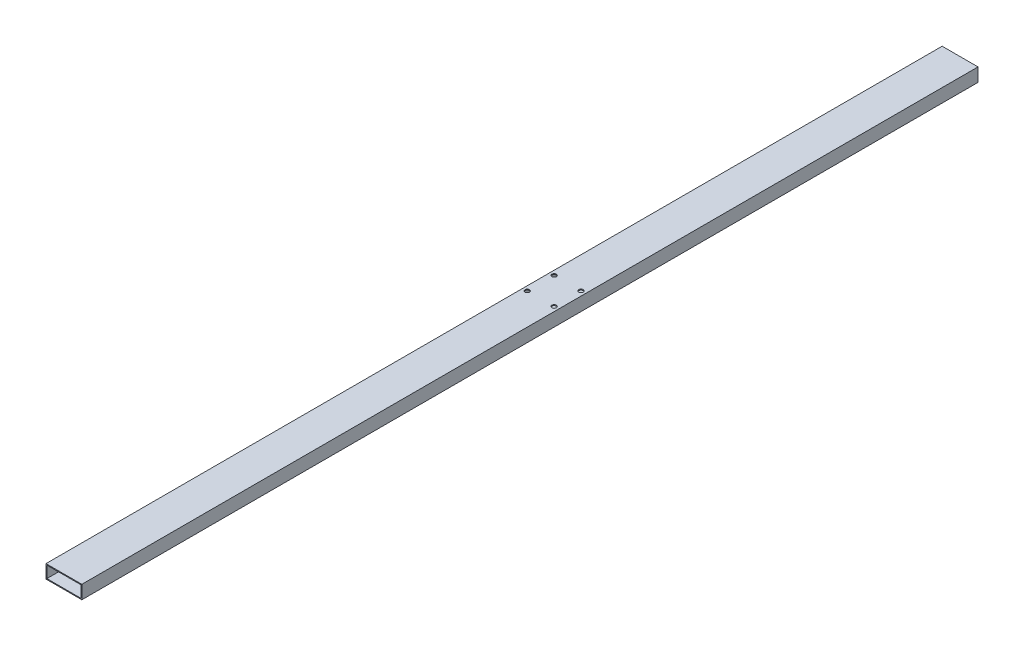
ISO-10303-21;
HEADER;
FILE_DESCRIPTION(('STEP AP214'),'2;1');
FILE_NAME('part.step','',(''),(''),'','','');
FILE_SCHEMA(('AUTOMOTIVE_DESIGN { 1 0 10303 214 1 1 1 1 }'));
ENDSEC;
DATA;
#1=APPLICATION_CONTEXT('core data for automotive mechanical design processes');
#2=APPLICATION_PROTOCOL_DEFINITION('international standard','automotive_design',2000,#1);
#3=PRODUCT_CONTEXT('',#1,'mechanical');
#4=PRODUCT('Part','Part','',(#3));
#5=PRODUCT_RELATED_PRODUCT_CATEGORY('part','',(#4));
#6=PRODUCT_DEFINITION_FORMATION('','',#4);
#7=PRODUCT_DEFINITION_CONTEXT('part definition',#1,'design');
#8=PRODUCT_DEFINITION('design','',#6,#7);
#9=PRODUCT_DEFINITION_SHAPE('','',#8);
#10=(LENGTH_UNIT() NAMED_UNIT(*) SI_UNIT(.MILLI.,.METRE.));
#11=(NAMED_UNIT(*) PLANE_ANGLE_UNIT() SI_UNIT($,.RADIAN.));
#12=(NAMED_UNIT(*) SI_UNIT($,.STERADIAN.) SOLID_ANGLE_UNIT());
#13=UNCERTAINTY_MEASURE_WITH_UNIT(LENGTH_MEASURE(1.E-05),#10,'distance_accuracy_value','');
#14=(GEOMETRIC_REPRESENTATION_CONTEXT(3) GLOBAL_UNCERTAINTY_ASSIGNED_CONTEXT((#13)) GLOBAL_UNIT_ASSIGNED_CONTEXT((#10,
#11,#12)) REPRESENTATION_CONTEXT('',''));
#15=CARTESIAN_POINT('',(0.,0.,0.));
#16=DIRECTION('',(0.,0.,1.));
#17=DIRECTION('',(1.,0.,0.));
#18=AXIS2_PLACEMENT_3D('',#15,#16,#17);
#19=CARTESIAN_POINT('',(0.,0.,1000.));
#20=DIRECTION('',(0.,0.,-1.));
#21=DIRECTION('',(-1.,0.,0.));
#22=AXIS2_PLACEMENT_3D('',#19,#20,#21);
#23=PLANE('',#22);
#24=DIRECTION('',(0.,-1.,0.));
#25=VECTOR('',#24,1.);
#26=CARTESIAN_POINT('',(0.,0.,1000.));
#27=LINE('',#26,#25);
#28=CARTESIAN_POINT('',(0.,15.,1000.));
#29=VERTEX_POINT('',#28);
#30=CARTESIAN_POINT('',(0.,0.,1000.));
#31=VERTEX_POINT('',#30);
#32=EDGE_CURVE('E140',#29,#31,#27,.T.);
#33=ORIENTED_EDGE('',*,*,#32,.T.);
#34=DIRECTION('',(1.,0.,0.));
#35=VECTOR('',#34,1.);
#36=CARTESIAN_POINT('',(0.,0.,1000.));
#37=LINE('',#36,#35);
#38=CARTESIAN_POINT('',(40.,0.,1000.));
#39=VERTEX_POINT('',#38);
#40=EDGE_CURVE('E143',#31,#39,#37,.T.);
#41=ORIENTED_EDGE('',*,*,#40,.T.);
#42=DIRECTION('',(0.,1.,0.));
#43=VECTOR('',#42,1.);
#44=CARTESIAN_POINT('',(40.,0.,1000.));
#45=LINE('',#44,#43);
#46=CARTESIAN_POINT('',(40.,15.,1000.));
#47=VERTEX_POINT('',#46);
#48=EDGE_CURVE('E146',#39,#47,#45,.T.);
#49=ORIENTED_EDGE('',*,*,#48,.T.);
#50=DIRECTION('',(-1.,0.,0.));
#51=VECTOR('',#50,1.);
#52=CARTESIAN_POINT('',(0.,15.,1000.));
#53=LINE('',#52,#51);
#54=EDGE_CURVE('E148',#47,#29,#53,.T.);
#55=ORIENTED_EDGE('',*,*,#54,.T.);
#56=EDGE_LOOP('',(#33,#41,#49,#55));
#57=FACE_BOUND('',#56,.T.);
#58=DIRECTION('',(0.,-1.,0.));
#59=VECTOR('',#58,1.);
#60=CARTESIAN_POINT('',(1.,1.,1000.));
#61=LINE('',#60,#59);
#62=CARTESIAN_POINT('',(1.,14.,1000.));
#63=VERTEX_POINT('',#62);
#64=CARTESIAN_POINT('',(1.,1.,1000.));
#65=VERTEX_POINT('',#64);
#66=EDGE_CURVE('E102',#63,#65,#61,.T.);
#67=ORIENTED_EDGE('',*,*,#66,.F.);
#68=DIRECTION('',(-1.,0.,0.));
#69=VECTOR('',#68,1.);
#70=CARTESIAN_POINT('',(1.,14.,1000.));
#71=LINE('',#70,#69);
#72=CARTESIAN_POINT('',(39.,14.,1000.));
#73=VERTEX_POINT('',#72);
#74=EDGE_CURVE('E124',#73,#63,#71,.T.);
#75=ORIENTED_EDGE('',*,*,#74,.F.);
#76=DIRECTION('',(0.,1.,0.));
#77=VECTOR('',#76,1.);
#78=CARTESIAN_POINT('',(39.,1.,1000.));
#79=LINE('',#78,#77);
#80=CARTESIAN_POINT('',(39.,1.,1000.));
#81=VERTEX_POINT('',#80);
#82=EDGE_CURVE('E122',#81,#73,#79,.T.);
#83=ORIENTED_EDGE('',*,*,#82,.F.);
#84=DIRECTION('',(1.,0.,0.));
#85=VECTOR('',#84,1.);
#86=CARTESIAN_POINT('',(1.,1.,1000.));
#87=LINE('',#86,#85);
#88=EDGE_CURVE('E110',#65,#81,#87,.T.);
#89=ORIENTED_EDGE('',*,*,#88,.F.);
#90=EDGE_LOOP('',(#67,#75,#83,#89));
#91=FACE_BOUND('',#90,.T.);
#92=ADVANCED_FACE('F35',(#57,#91),#23,.F.);
#93=CARTESIAN_POINT('',(0.,0.,0.));
#94=DIRECTION('',(0.,0.,-1.));
#95=DIRECTION('',(-1.,0.,0.));
#96=AXIS2_PLACEMENT_3D('',#93,#94,#95);
#97=PLANE('',#96);
#98=DIRECTION('',(0.,-1.,0.));
#99=VECTOR('',#98,1.);
#100=CARTESIAN_POINT('',(0.,0.,0.));
#101=LINE('',#100,#99);
#102=CARTESIAN_POINT('',(0.,15.,0.));
#103=VERTEX_POINT('',#102);
#104=CARTESIAN_POINT('',(0.,0.,0.));
#105=VERTEX_POINT('',#104);
#106=EDGE_CURVE('E118',#103,#105,#101,.T.);
#107=ORIENTED_EDGE('',*,*,#106,.F.);
#108=DIRECTION('',(-1.,0.,0.));
#109=VECTOR('',#108,1.);
#110=CARTESIAN_POINT('',(0.,15.,0.));
#111=LINE('',#110,#109);
#112=CARTESIAN_POINT('',(40.,15.,0.));
#113=VERTEX_POINT('',#112);
#114=EDGE_CURVE('E144',#113,#103,#111,.T.);
#115=ORIENTED_EDGE('',*,*,#114,.F.);
#116=DIRECTION('',(0.,1.,0.));
#117=VECTOR('',#116,1.);
#118=CARTESIAN_POINT('',(40.,0.,0.));
#119=LINE('',#118,#117);
#120=CARTESIAN_POINT('',(40.,0.,0.));
#121=VERTEX_POINT('',#120);
#122=EDGE_CURVE('E155',#121,#113,#119,.T.);
#123=ORIENTED_EDGE('',*,*,#122,.F.);
#124=DIRECTION('',(1.,0.,0.));
#125=VECTOR('',#124,1.);
#126=CARTESIAN_POINT('',(0.,0.,0.));
#127=LINE('',#126,#125);
#128=EDGE_CURVE('E153',#105,#121,#127,.T.);
#129=ORIENTED_EDGE('',*,*,#128,.F.);
#130=EDGE_LOOP('',(#107,#115,#123,#129));
#131=FACE_BOUND('',#130,.T.);
#132=DIRECTION('',(-1.,0.,0.));
#133=VECTOR('',#132,1.);
#134=CARTESIAN_POINT('',(1.,14.,0.));
#135=LINE('',#134,#133);
#136=CARTESIAN_POINT('',(39.,14.,0.));
#137=VERTEX_POINT('',#136);
#138=CARTESIAN_POINT('',(1.,14.,0.));
#139=VERTEX_POINT('',#138);
#140=EDGE_CURVE('E111',#137,#139,#135,.T.);
#141=ORIENTED_EDGE('',*,*,#140,.T.);
#142=DIRECTION('',(0.,-1.,0.));
#143=VECTOR('',#142,1.);
#144=CARTESIAN_POINT('',(1.,1.,0.));
#145=LINE('',#144,#143);
#146=CARTESIAN_POINT('',(1.,1.,0.));
#147=VERTEX_POINT('',#146);
#148=EDGE_CURVE('E60',#139,#147,#145,.T.);
#149=ORIENTED_EDGE('',*,*,#148,.T.);
#150=DIRECTION('',(1.,0.,0.));
#151=VECTOR('',#150,1.);
#152=CARTESIAN_POINT('',(1.,1.,0.));
#153=LINE('',#152,#151);
#154=CARTESIAN_POINT('',(39.,1.,0.));
#155=VERTEX_POINT('',#154);
#156=EDGE_CURVE('E117',#147,#155,#153,.T.);
#157=ORIENTED_EDGE('',*,*,#156,.T.);
#158=DIRECTION('',(0.,1.,0.));
#159=VECTOR('',#158,1.);
#160=CARTESIAN_POINT('',(39.,1.,0.));
#161=LINE('',#160,#159);
#162=EDGE_CURVE('E132',#155,#137,#161,.T.);
#163=ORIENTED_EDGE('',*,*,#162,.T.);
#164=EDGE_LOOP('',(#141,#149,#157,#163));
#165=FACE_BOUND('',#164,.T.);
#166=ADVANCED_FACE('F207',(#131,#165),#97,.T.);
#167=CARTESIAN_POINT('',(0.,0.,1000.));
#168=DIRECTION('',(1.,0.,0.));
#169=DIRECTION('',(0.,0.,-1.));
#170=AXIS2_PLACEMENT_3D('',#167,#168,#169);
#171=PLANE('',#170);
#172=ORIENTED_EDGE('',*,*,#106,.T.);
#173=DIRECTION('',(0.,0.,-1.));
#174=VECTOR('',#173,1.);
#175=CARTESIAN_POINT('',(0.,0.,1000.));
#176=LINE('',#175,#174);
#177=EDGE_CURVE('E11',#31,#105,#176,.T.);
#178=ORIENTED_EDGE('',*,*,#177,.F.);
#179=ORIENTED_EDGE('',*,*,#32,.F.);
#180=DIRECTION('',(0.,0.,-1.));
#181=VECTOR('',#180,1.);
#182=CARTESIAN_POINT('',(0.,15.,1000.));
#183=LINE('',#182,#181);
#184=EDGE_CURVE('E150',#29,#103,#183,.T.);
#185=ORIENTED_EDGE('',*,*,#184,.T.);
#186=EDGE_LOOP('',(#172,#178,#179,#185));
#187=FACE_BOUND('',#186,.T.);
#188=ADVANCED_FACE('F37',(#187),#171,.F.);
#189=CARTESIAN_POINT('',(0.,0.,1000.));
#190=DIRECTION('',(0.,1.,0.));
#191=DIRECTION('',(0.,0.,1.));
#192=AXIS2_PLACEMENT_3D('',#189,#190,#191);
#193=PLANE('',#192);
#194=CARTESIAN_POINT('',(35.0000000000011,0.,438.000000000003));
#195=DIRECTION('',(0.,-1.,0.));
#196=DIRECTION('',(0.,0.,-1.));
#197=AXIS2_PLACEMENT_3D('',#194,#195,#196);
#198=CIRCLE('',#197,2.49999999999817);
#199=CARTESIAN_POINT('',(35.0000000000011,0.,435.500000000005));
#200=VERTEX_POINT('',#199);
#201=EDGE_CURVE('E243',#200,#200,#198,.T.);
#202=ORIENTED_EDGE('',*,*,#201,.F.);
#203=EDGE_LOOP('',(#202));
#204=FACE_BOUND('',#203,.T.);
#205=CARTESIAN_POINT('',(5.00000000000111,0.,468.000000000003));
#206=DIRECTION('',(0.,-1.,0.));
#207=DIRECTION('',(0.,0.,-1.));
#208=AXIS2_PLACEMENT_3D('',#205,#206,#207);
#209=CIRCLE('',#208,2.49999999999817);
#210=CARTESIAN_POINT('',(5.00000000000111,0.,465.500000000005));
#211=VERTEX_POINT('',#210);
#212=EDGE_CURVE('E247',#211,#211,#209,.T.);
#213=ORIENTED_EDGE('',*,*,#212,.F.);
#214=EDGE_LOOP('',(#213));
#215=FACE_BOUND('',#214,.T.);
#216=CARTESIAN_POINT('',(5.0000000000011,0.,438.000000000003));
#217=DIRECTION('',(0.,-1.,0.));
#218=DIRECTION('',(0.,0.,-1.));
#219=AXIS2_PLACEMENT_3D('',#216,#217,#218);
#220=CIRCLE('',#219,2.49999999999817);
#221=CARTESIAN_POINT('',(5.0000000000011,0.,435.500000000005));
#222=VERTEX_POINT('',#221);
#223=EDGE_CURVE('E251',#222,#222,#220,.T.);
#224=ORIENTED_EDGE('',*,*,#223,.F.);
#225=EDGE_LOOP('',(#224));
#226=FACE_BOUND('',#225,.T.);
#227=CARTESIAN_POINT('',(35.0000000000011,0.,468.000000000003));
#228=DIRECTION('',(0.,-1.,0.));
#229=DIRECTION('',(0.,0.,-1.));
#230=AXIS2_PLACEMENT_3D('',#227,#228,#229);
#231=CIRCLE('',#230,2.49999999999812);
#232=CARTESIAN_POINT('',(35.0000000000011,0.,465.500000000005));
#233=VERTEX_POINT('',#232);
#234=EDGE_CURVE('E255',#233,#233,#231,.T.);
#235=ORIENTED_EDGE('',*,*,#234,.F.);
#236=EDGE_LOOP('',(#235));
#237=FACE_BOUND('',#236,.T.);
#238=ORIENTED_EDGE('',*,*,#128,.T.);
#239=DIRECTION('',(0.,0.,-1.));
#240=VECTOR('',#239,1.);
#241=CARTESIAN_POINT('',(40.,0.,1000.));
#242=LINE('',#241,#240);
#243=EDGE_CURVE('E44',#39,#121,#242,.T.);
#244=ORIENTED_EDGE('',*,*,#243,.F.);
#245=ORIENTED_EDGE('',*,*,#40,.F.);
#246=ORIENTED_EDGE('',*,*,#177,.T.);
#247=EDGE_LOOP('',(#238,#244,#245,#246));
#248=FACE_BOUND('',#247,.T.);
#249=ADVANCED_FACE('F232',(#204,#215,#226,#237,#248),#193,.F.);
#250=CARTESIAN_POINT('',(40.,0.,1000.));
#251=DIRECTION('',(-1.,0.,0.));
#252=DIRECTION('',(0.,0.,1.));
#253=AXIS2_PLACEMENT_3D('',#250,#251,#252);
#254=PLANE('',#253);
#255=ORIENTED_EDGE('',*,*,#122,.T.);
#256=DIRECTION('',(0.,0.,-1.));
#257=VECTOR('',#256,1.);
#258=CARTESIAN_POINT('',(40.,15.,1000.));
#259=LINE('',#258,#257);
#260=EDGE_CURVE('E160',#47,#113,#259,.T.);
#261=ORIENTED_EDGE('',*,*,#260,.F.);
#262=ORIENTED_EDGE('',*,*,#48,.F.);
#263=ORIENTED_EDGE('',*,*,#243,.T.);
#264=EDGE_LOOP('',(#255,#261,#262,#263));
#265=FACE_BOUND('',#264,.T.);
#266=ADVANCED_FACE('F229',(#265),#254,.F.);
#267=CARTESIAN_POINT('',(0.,15.,1000.));
#268=DIRECTION('',(0.,-1.,0.));
#269=DIRECTION('',(0.,0.,-1.));
#270=AXIS2_PLACEMENT_3D('',#267,#268,#269);
#271=PLANE('',#270);
#272=CARTESIAN_POINT('',(35.0000000000011,15.,438.000000000003));
#273=DIRECTION('',(0.,-1.,0.));
#274=DIRECTION('',(0.,0.,-1.));
#275=AXIS2_PLACEMENT_3D('',#272,#273,#274);
#276=CIRCLE('',#275,2.49999999999817);
#277=CARTESIAN_POINT('',(35.0000000000011,15.,435.500000000005));
#278=VERTEX_POINT('',#277);
#279=EDGE_CURVE('E268',#278,#278,#276,.T.);
#280=ORIENTED_EDGE('',*,*,#279,.T.);
#281=EDGE_LOOP('',(#280));
#282=FACE_BOUND('',#281,.T.);
#283=CARTESIAN_POINT('',(5.00000000000111,15.,468.000000000003));
#284=DIRECTION('',(0.,-1.,0.));
#285=DIRECTION('',(0.,0.,-1.));
#286=AXIS2_PLACEMENT_3D('',#283,#284,#285);
#287=CIRCLE('',#286,2.49999999999817);
#288=CARTESIAN_POINT('',(5.00000000000111,15.,465.500000000005));
#289=VERTEX_POINT('',#288);
#290=EDGE_CURVE('E275',#289,#289,#287,.T.);
#291=ORIENTED_EDGE('',*,*,#290,.T.);
#292=EDGE_LOOP('',(#291));
#293=FACE_BOUND('',#292,.T.);
#294=CARTESIAN_POINT('',(5.0000000000011,15.,438.000000000003));
#295=DIRECTION('',(0.,-1.,0.));
#296=DIRECTION('',(0.,0.,-1.));
#297=AXIS2_PLACEMENT_3D('',#294,#295,#296);
#298=CIRCLE('',#297,2.49999999999817);
#299=CARTESIAN_POINT('',(5.0000000000011,15.,435.500000000005));
#300=VERTEX_POINT('',#299);
#301=EDGE_CURVE('E276',#300,#300,#298,.T.);
#302=ORIENTED_EDGE('',*,*,#301,.T.);
#303=EDGE_LOOP('',(#302));
#304=FACE_BOUND('',#303,.T.);
#305=CARTESIAN_POINT('',(35.0000000000011,15.,468.000000000003));
#306=DIRECTION('',(0.,-1.,0.));
#307=DIRECTION('',(0.,0.,-1.));
#308=AXIS2_PLACEMENT_3D('',#305,#306,#307);
#309=CIRCLE('',#308,2.49999999999812);
#310=CARTESIAN_POINT('',(35.0000000000011,15.,465.500000000005));
#311=VERTEX_POINT('',#310);
#312=EDGE_CURVE('E169',#311,#311,#309,.T.);
#313=ORIENTED_EDGE('',*,*,#312,.T.);
#314=EDGE_LOOP('',(#313));
#315=FACE_BOUND('',#314,.T.);
#316=ORIENTED_EDGE('',*,*,#114,.T.);
#317=ORIENTED_EDGE('',*,*,#184,.F.);
#318=ORIENTED_EDGE('',*,*,#54,.F.);
#319=ORIENTED_EDGE('',*,*,#260,.T.);
#320=EDGE_LOOP('',(#316,#317,#318,#319));
#321=FACE_BOUND('',#320,.T.);
#322=ADVANCED_FACE('F226',(#282,#293,#304,#315,#321),#271,.F.);
#323=CARTESIAN_POINT('',(1.,1.,1000.));
#324=DIRECTION('',(1.,0.,0.));
#325=DIRECTION('',(0.,0.,-1.));
#326=AXIS2_PLACEMENT_3D('',#323,#324,#325);
#327=PLANE('',#326);
#328=ORIENTED_EDGE('',*,*,#148,.F.);
#329=DIRECTION('',(0.,0.,-1.));
#330=VECTOR('',#329,1.);
#331=CARTESIAN_POINT('',(1.,14.,1000.));
#332=LINE('',#331,#330);
#333=EDGE_CURVE('E106',#63,#139,#332,.T.);
#334=ORIENTED_EDGE('',*,*,#333,.F.);
#335=ORIENTED_EDGE('',*,*,#66,.T.);
#336=DIRECTION('',(0.,0.,-1.));
#337=VECTOR('',#336,1.);
#338=CARTESIAN_POINT('',(1.,1.,1000.));
#339=LINE('',#338,#337);
#340=EDGE_CURVE('E105',#65,#147,#339,.T.);
#341=ORIENTED_EDGE('',*,*,#340,.T.);
#342=EDGE_LOOP('',(#328,#334,#335,#341));
#343=FACE_BOUND('',#342,.T.);
#344=ADVANCED_FACE('F104',(#343),#327,.T.);
#345=CARTESIAN_POINT('',(1.,1.,1000.));
#346=DIRECTION('',(0.,1.,0.));
#347=DIRECTION('',(0.,0.,1.));
#348=AXIS2_PLACEMENT_3D('',#345,#346,#347);
#349=PLANE('',#348);
#350=CARTESIAN_POINT('',(35.0000000000011,1.,438.000000000003));
#351=DIRECTION('',(0.,1.,0.));
#352=DIRECTION('',(0.,0.,1.));
#353=AXIS2_PLACEMENT_3D('',#350,#351,#352);
#354=CIRCLE('',#353,2.49999999999817);
#355=CARTESIAN_POINT('',(35.0000000000011,1.,440.500000000001));
#356=VERTEX_POINT('',#355);
#357=EDGE_CURVE('E130',#356,#356,#354,.T.);
#358=ORIENTED_EDGE('',*,*,#357,.F.);
#359=EDGE_LOOP('',(#358));
#360=FACE_BOUND('',#359,.T.);
#361=CARTESIAN_POINT('',(5.00000000000111,1.,468.000000000003));
#362=DIRECTION('',(0.,1.,0.));
#363=DIRECTION('',(0.,0.,1.));
#364=AXIS2_PLACEMENT_3D('',#361,#362,#363);
#365=CIRCLE('',#364,2.49999999999817);
#366=CARTESIAN_POINT('',(5.00000000000111,1.,470.500000000001));
#367=VERTEX_POINT('',#366);
#368=EDGE_CURVE('E175',#367,#367,#365,.T.);
#369=ORIENTED_EDGE('',*,*,#368,.F.);
#370=EDGE_LOOP('',(#369));
#371=FACE_BOUND('',#370,.T.);
#372=CARTESIAN_POINT('',(5.0000000000011,1.,438.000000000003));
#373=DIRECTION('',(0.,1.,0.));
#374=DIRECTION('',(0.,0.,1.));
#375=AXIS2_PLACEMENT_3D('',#372,#373,#374);
#376=CIRCLE('',#375,2.49999999999817);
#377=CARTESIAN_POINT('',(5.0000000000011,1.,440.500000000001));
#378=VERTEX_POINT('',#377);
#379=EDGE_CURVE('E172',#378,#378,#376,.T.);
#380=ORIENTED_EDGE('',*,*,#379,.F.);
#381=EDGE_LOOP('',(#380));
#382=FACE_BOUND('',#381,.T.);
#383=CARTESIAN_POINT('',(35.0000000000011,1.,468.000000000003));
#384=DIRECTION('',(0.,1.,0.));
#385=DIRECTION('',(0.,0.,1.));
#386=AXIS2_PLACEMENT_3D('',#383,#384,#385);
#387=CIRCLE('',#386,2.49999999999812);
#388=CARTESIAN_POINT('',(35.0000000000011,1.,470.500000000001));
#389=VERTEX_POINT('',#388);
#390=EDGE_CURVE('E168',#389,#389,#387,.T.);
#391=ORIENTED_EDGE('',*,*,#390,.F.);
#392=EDGE_LOOP('',(#391));
#393=FACE_BOUND('',#392,.T.);
#394=ORIENTED_EDGE('',*,*,#156,.F.);
#395=ORIENTED_EDGE('',*,*,#340,.F.);
#396=ORIENTED_EDGE('',*,*,#88,.T.);
#397=DIRECTION('',(0.,0.,-1.));
#398=VECTOR('',#397,1.);
#399=CARTESIAN_POINT('',(39.,1.,1000.));
#400=LINE('',#399,#398);
#401=EDGE_CURVE('E119',#81,#155,#400,.T.);
#402=ORIENTED_EDGE('',*,*,#401,.T.);
#403=EDGE_LOOP('',(#394,#395,#396,#402));
#404=FACE_BOUND('',#403,.T.);
#405=ADVANCED_FACE('F114',(#360,#371,#382,#393,#404),#349,.T.);
#406=CARTESIAN_POINT('',(39.,1.,1000.));
#407=DIRECTION('',(-1.,0.,0.));
#408=DIRECTION('',(0.,0.,1.));
#409=AXIS2_PLACEMENT_3D('',#406,#407,#408);
#410=PLANE('',#409);
#411=ORIENTED_EDGE('',*,*,#162,.F.);
#412=ORIENTED_EDGE('',*,*,#401,.F.);
#413=ORIENTED_EDGE('',*,*,#82,.T.);
#414=DIRECTION('',(0.,0.,-1.));
#415=VECTOR('',#414,1.);
#416=CARTESIAN_POINT('',(39.,14.,1000.));
#417=LINE('',#416,#415);
#418=EDGE_CURVE('E52',#73,#137,#417,.T.);
#419=ORIENTED_EDGE('',*,*,#418,.T.);
#420=EDGE_LOOP('',(#411,#412,#413,#419));
#421=FACE_BOUND('',#420,.T.);
#422=ADVANCED_FACE('F199',(#421),#410,.T.);
#423=CARTESIAN_POINT('',(1.,14.,1000.));
#424=DIRECTION('',(0.,-1.,0.));
#425=DIRECTION('',(0.,0.,-1.));
#426=AXIS2_PLACEMENT_3D('',#423,#424,#425);
#427=PLANE('',#426);
#428=CARTESIAN_POINT('',(35.0000000000011,14.,438.000000000003));
#429=DIRECTION('',(0.,-1.,0.));
#430=DIRECTION('',(0.,0.,-1.));
#431=AXIS2_PLACEMENT_3D('',#428,#429,#430);
#432=CIRCLE('',#431,2.49999999999817);
#433=CARTESIAN_POINT('',(35.0000000000011,14.,435.500000000005));
#434=VERTEX_POINT('',#433);
#435=EDGE_CURVE('E39',#434,#434,#432,.T.);
#436=ORIENTED_EDGE('',*,*,#435,.F.);
#437=EDGE_LOOP('',(#436));
#438=FACE_BOUND('',#437,.T.);
#439=CARTESIAN_POINT('',(5.00000000000111,14.,468.000000000003));
#440=DIRECTION('',(0.,-1.,0.));
#441=DIRECTION('',(0.,0.,-1.));
#442=AXIS2_PLACEMENT_3D('',#439,#440,#441);
#443=CIRCLE('',#442,2.49999999999817);
#444=CARTESIAN_POINT('',(5.00000000000111,14.,465.500000000005));
#445=VERTEX_POINT('',#444);
#446=EDGE_CURVE('E173',#445,#445,#443,.T.);
#447=ORIENTED_EDGE('',*,*,#446,.F.);
#448=EDGE_LOOP('',(#447));
#449=FACE_BOUND('',#448,.T.);
#450=CARTESIAN_POINT('',(5.0000000000011,14.,438.000000000003));
#451=DIRECTION('',(0.,-1.,0.));
#452=DIRECTION('',(0.,0.,-1.));
#453=AXIS2_PLACEMENT_3D('',#450,#451,#452);
#454=CIRCLE('',#453,2.49999999999817);
#455=CARTESIAN_POINT('',(5.0000000000011,14.,435.500000000005));
#456=VERTEX_POINT('',#455);
#457=EDGE_CURVE('E170',#456,#456,#454,.T.);
#458=ORIENTED_EDGE('',*,*,#457,.F.);
#459=EDGE_LOOP('',(#458));
#460=FACE_BOUND('',#459,.T.);
#461=CARTESIAN_POINT('',(35.0000000000011,14.,468.000000000003));
#462=DIRECTION('',(0.,-1.,0.));
#463=DIRECTION('',(0.,0.,-1.));
#464=AXIS2_PLACEMENT_3D('',#461,#462,#463);
#465=CIRCLE('',#464,2.49999999999812);
#466=CARTESIAN_POINT('',(35.0000000000011,14.,465.500000000005));
#467=VERTEX_POINT('',#466);
#468=EDGE_CURVE('E165',#467,#467,#465,.T.);
#469=ORIENTED_EDGE('',*,*,#468,.F.);
#470=EDGE_LOOP('',(#469));
#471=FACE_BOUND('',#470,.T.);
#472=ORIENTED_EDGE('',*,*,#140,.F.);
#473=ORIENTED_EDGE('',*,*,#418,.F.);
#474=ORIENTED_EDGE('',*,*,#74,.T.);
#475=ORIENTED_EDGE('',*,*,#333,.T.);
#476=EDGE_LOOP('',(#472,#473,#474,#475));
#477=FACE_BOUND('',#476,.T.);
#478=ADVANCED_FACE('F195',(#438,#449,#460,#471,#477),#427,.T.);
#479=CARTESIAN_POINT('',(35.0000000000011,15.,468.000000000003));
#480=DIRECTION('',(0.,-1.,0.));
#481=DIRECTION('',(0.,0.,-1.));
#482=AXIS2_PLACEMENT_3D('',#479,#480,#481);
#483=CYLINDRICAL_SURFACE('',#482,2.49999999999812);
#484=ORIENTED_EDGE('',*,*,#468,.T.);
#485=EDGE_LOOP('',(#484));
#486=FACE_BOUND('',#485,.T.);
#487=ORIENTED_EDGE('',*,*,#312,.F.);
#488=EDGE_LOOP('',(#487));
#489=FACE_BOUND('',#488,.T.);
#490=ADVANCED_FACE('F198',(#486,#489),#483,.F.);
#491=CARTESIAN_POINT('',(5.0000000000011,15.,438.000000000003));
#492=DIRECTION('',(0.,-1.,0.));
#493=DIRECTION('',(0.,0.,-1.));
#494=AXIS2_PLACEMENT_3D('',#491,#492,#493);
#495=CYLINDRICAL_SURFACE('',#494,2.49999999999817);
#496=ORIENTED_EDGE('',*,*,#457,.T.);
#497=EDGE_LOOP('',(#496));
#498=FACE_BOUND('',#497,.T.);
#499=ORIENTED_EDGE('',*,*,#301,.F.);
#500=EDGE_LOOP('',(#499));
#501=FACE_BOUND('',#500,.T.);
#502=ADVANCED_FACE('F286',(#498,#501),#495,.F.);
#503=CARTESIAN_POINT('',(5.00000000000111,15.,468.000000000003));
#504=DIRECTION('',(0.,-1.,0.));
#505=DIRECTION('',(0.,0.,-1.));
#506=AXIS2_PLACEMENT_3D('',#503,#504,#505);
#507=CYLINDRICAL_SURFACE('',#506,2.49999999999817);
#508=ORIENTED_EDGE('',*,*,#446,.T.);
#509=EDGE_LOOP('',(#508));
#510=FACE_BOUND('',#509,.T.);
#511=ORIENTED_EDGE('',*,*,#290,.F.);
#512=EDGE_LOOP('',(#511));
#513=FACE_BOUND('',#512,.T.);
#514=ADVANCED_FACE('F288',(#510,#513),#507,.F.);
#515=CARTESIAN_POINT('',(35.0000000000011,15.,438.000000000003));
#516=DIRECTION('',(0.,-1.,0.));
#517=DIRECTION('',(0.,0.,-1.));
#518=AXIS2_PLACEMENT_3D('',#515,#516,#517);
#519=CYLINDRICAL_SURFACE('',#518,2.49999999999817);
#520=ORIENTED_EDGE('',*,*,#435,.T.);
#521=EDGE_LOOP('',(#520));
#522=FACE_BOUND('',#521,.T.);
#523=ORIENTED_EDGE('',*,*,#279,.F.);
#524=EDGE_LOOP('',(#523));
#525=FACE_BOUND('',#524,.T.);
#526=ADVANCED_FACE('F192',(#522,#525),#519,.F.);
#527=ORIENTED_EDGE('',*,*,#390,.T.);
#528=EDGE_LOOP('',(#527));
#529=FACE_BOUND('',#528,.T.);
#530=ORIENTED_EDGE('',*,*,#234,.T.);
#531=EDGE_LOOP('',(#530));
#532=FACE_BOUND('',#531,.T.);
#533=ADVANCED_FACE('F300',(#529,#532),#483,.F.);
#534=ORIENTED_EDGE('',*,*,#379,.T.);
#535=EDGE_LOOP('',(#534));
#536=FACE_BOUND('',#535,.T.);
#537=ORIENTED_EDGE('',*,*,#223,.T.);
#538=EDGE_LOOP('',(#537));
#539=FACE_BOUND('',#538,.T.);
#540=ADVANCED_FACE('F291',(#536,#539),#495,.F.);
#541=ORIENTED_EDGE('',*,*,#368,.T.);
#542=EDGE_LOOP('',(#541));
#543=FACE_BOUND('',#542,.T.);
#544=ORIENTED_EDGE('',*,*,#212,.T.);
#545=EDGE_LOOP('',(#544));
#546=FACE_BOUND('',#545,.T.);
#547=ADVANCED_FACE('F297',(#543,#546),#507,.F.);
#548=ORIENTED_EDGE('',*,*,#357,.T.);
#549=EDGE_LOOP('',(#548));
#550=FACE_BOUND('',#549,.T.);
#551=ORIENTED_EDGE('',*,*,#201,.T.);
#552=EDGE_LOOP('',(#551));
#553=FACE_BOUND('',#552,.T.);
#554=ADVANCED_FACE('F307',(#550,#553),#519,.F.);
#555=CLOSED_SHELL('',(#92,#166,#188,#249,#266,#322,#344,#405,#422,#478,#490,#502,#514,#526,#533,
#540,#547,#554));
#556=MANIFOLD_SOLID_BREP('B2',#555);
#557=ADVANCED_BREP_SHAPE_REPRESENTATION('',(#18,#556),#14);
#558=SHAPE_DEFINITION_REPRESENTATION(#9,#557);
ENDSEC;
END-ISO-10303-21;
